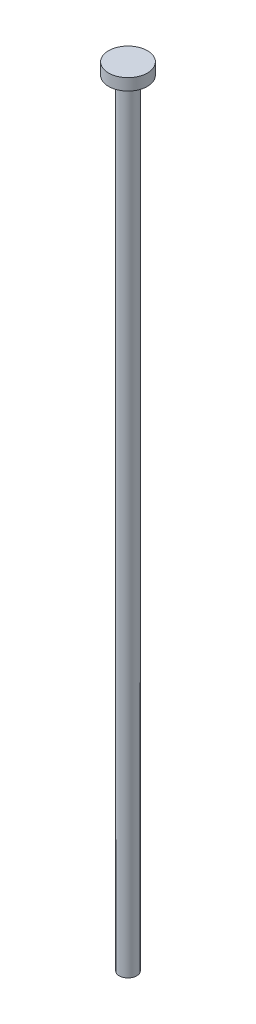
ISO-10303-21;
HEADER;
FILE_DESCRIPTION(('STEP AP214'),'2;1');
FILE_NAME('part.step','',(''),(''),'','','');
FILE_SCHEMA(('AUTOMOTIVE_DESIGN { 1 0 10303 214 1 1 1 1 }'));
ENDSEC;
DATA;
#1=APPLICATION_CONTEXT('core data for automotive mechanical design processes');
#2=APPLICATION_PROTOCOL_DEFINITION('international standard','automotive_design',2000,#1);
#3=PRODUCT_CONTEXT('',#1,'mechanical');
#4=PRODUCT('Part','Part','',(#3));
#5=PRODUCT_RELATED_PRODUCT_CATEGORY('part','',(#4));
#6=PRODUCT_DEFINITION_FORMATION('','',#4);
#7=PRODUCT_DEFINITION_CONTEXT('part definition',#1,'design');
#8=PRODUCT_DEFINITION('design','',#6,#7);
#9=PRODUCT_DEFINITION_SHAPE('','',#8);
#10=(LENGTH_UNIT() NAMED_UNIT(*) SI_UNIT(.MILLI.,.METRE.));
#11=(NAMED_UNIT(*) PLANE_ANGLE_UNIT() SI_UNIT($,.RADIAN.));
#12=(NAMED_UNIT(*) SI_UNIT($,.STERADIAN.) SOLID_ANGLE_UNIT());
#13=UNCERTAINTY_MEASURE_WITH_UNIT(LENGTH_MEASURE(1.E-05),#10,'distance_accuracy_value','');
#14=(GEOMETRIC_REPRESENTATION_CONTEXT(3) GLOBAL_UNCERTAINTY_ASSIGNED_CONTEXT((#13)) GLOBAL_UNIT_ASSIGNED_CONTEXT((#10,
#11,#12)) REPRESENTATION_CONTEXT('',''));
#15=CARTESIAN_POINT('',(0.,0.,0.));
#16=DIRECTION('',(0.,0.,1.));
#17=DIRECTION('',(1.,0.,0.));
#18=AXIS2_PLACEMENT_3D('',#15,#16,#17);
#19=CARTESIAN_POINT('',(0.,100.,0.));
#20=DIRECTION('',(0.,-1.,0.));
#21=DIRECTION('',(0.,0.,-1.));
#22=AXIS2_PLACEMENT_3D('',#19,#20,#21);
#23=CYLINDRICAL_SURFACE('',#22,2.25);
#24=CARTESIAN_POINT('',(0.,100.,0.));
#25=DIRECTION('',(0.,1.,0.));
#26=DIRECTION('',(0.,0.,1.));
#27=AXIS2_PLACEMENT_3D('',#24,#25,#26);
#28=CIRCLE('',#27,2.25);
#29=CARTESIAN_POINT('',(0.,100.,2.25));
#30=VERTEX_POINT('',#29);
#31=EDGE_CURVE('E10',#30,#30,#28,.T.);
#32=ORIENTED_EDGE('',*,*,#31,.F.);
#33=EDGE_LOOP('',(#32));
#34=FACE_BOUND('',#33,.T.);
#35=CARTESIAN_POINT('',(0.,-100.,0.));
#36=DIRECTION('',(0.,1.,0.));
#37=DIRECTION('',(0.,0.,1.));
#38=AXIS2_PLACEMENT_3D('',#35,#36,#37);
#39=CIRCLE('',#38,2.25);
#40=CARTESIAN_POINT('',(0.,-100.,2.25));
#41=VERTEX_POINT('',#40);
#42=EDGE_CURVE('E40',#41,#41,#39,.T.);
#43=ORIENTED_EDGE('',*,*,#42,.T.);
#44=EDGE_LOOP('',(#43));
#45=FACE_BOUND('',#44,.T.);
#46=ADVANCED_FACE('F37',(#34,#45),#23,.T.);
#47=CARTESIAN_POINT('',(0.,-100.,0.));
#48=DIRECTION('',(0.,1.,0.));
#49=DIRECTION('',(0.,0.,1.));
#50=AXIS2_PLACEMENT_3D('',#47,#48,#49);
#51=PLANE('',#50);
#52=ORIENTED_EDGE('',*,*,#42,.F.);
#53=EDGE_LOOP('',(#52));
#54=FACE_BOUND('',#53,.T.);
#55=ADVANCED_FACE('F60',(#54),#51,.F.);
#56=CARTESIAN_POINT('',(0.,103.,0.));
#57=DIRECTION('',(0.,-1.,0.));
#58=DIRECTION('',(0.,0.,-1.));
#59=AXIS2_PLACEMENT_3D('',#56,#57,#58);
#60=CYLINDRICAL_SURFACE('',#59,5.);
#61=CARTESIAN_POINT('',(0.,103.,0.));
#62=DIRECTION('',(0.,1.,0.));
#63=DIRECTION('',(0.,0.,1.));
#64=AXIS2_PLACEMENT_3D('',#61,#62,#63);
#65=CIRCLE('',#64,5.);
#66=CARTESIAN_POINT('',(0.,103.,5.));
#67=VERTEX_POINT('',#66);
#68=EDGE_CURVE('E47',#67,#67,#65,.T.);
#69=ORIENTED_EDGE('',*,*,#68,.F.);
#70=EDGE_LOOP('',(#69));
#71=FACE_BOUND('',#70,.T.);
#72=CARTESIAN_POINT('',(0.,100.,0.));
#73=DIRECTION('',(0.,1.,0.));
#74=DIRECTION('',(0.,0.,1.));
#75=AXIS2_PLACEMENT_3D('',#72,#73,#74);
#76=CIRCLE('',#75,5.);
#77=CARTESIAN_POINT('',(0.,100.,5.));
#78=VERTEX_POINT('',#77);
#79=EDGE_CURVE('E49',#78,#78,#76,.T.);
#80=ORIENTED_EDGE('',*,*,#79,.T.);
#81=EDGE_LOOP('',(#80));
#82=FACE_BOUND('',#81,.T.);
#83=ADVANCED_FACE('F57',(#71,#82),#60,.T.);
#84=CARTESIAN_POINT('',(0.,103.,0.));
#85=DIRECTION('',(0.,1.,0.));
#86=DIRECTION('',(0.,0.,1.));
#87=AXIS2_PLACEMENT_3D('',#84,#85,#86);
#88=PLANE('',#87);
#89=ORIENTED_EDGE('',*,*,#68,.T.);
#90=EDGE_LOOP('',(#89));
#91=FACE_BOUND('',#90,.T.);
#92=ADVANCED_FACE('F55',(#91),#88,.T.);
#93=CARTESIAN_POINT('',(0.,100.,0.));
#94=DIRECTION('',(0.,1.,0.));
#95=DIRECTION('',(0.,0.,1.));
#96=AXIS2_PLACEMENT_3D('',#93,#94,#95);
#97=PLANE('',#96);
#98=ORIENTED_EDGE('',*,*,#31,.T.);
#99=EDGE_LOOP('',(#98));
#100=FACE_BOUND('',#99,.T.);
#101=ORIENTED_EDGE('',*,*,#79,.F.);
#102=EDGE_LOOP('',(#101));
#103=FACE_BOUND('',#102,.T.);
#104=ADVANCED_FACE('F64',(#100,#103),#97,.F.);
#105=CLOSED_SHELL('',(#46,#55,#83,#92,#104));
#106=MANIFOLD_SOLID_BREP('B2',#105);
#107=ADVANCED_BREP_SHAPE_REPRESENTATION('',(#18,#106),#14);
#108=SHAPE_DEFINITION_REPRESENTATION(#9,#107);
ENDSEC;
END-ISO-10303-21;
